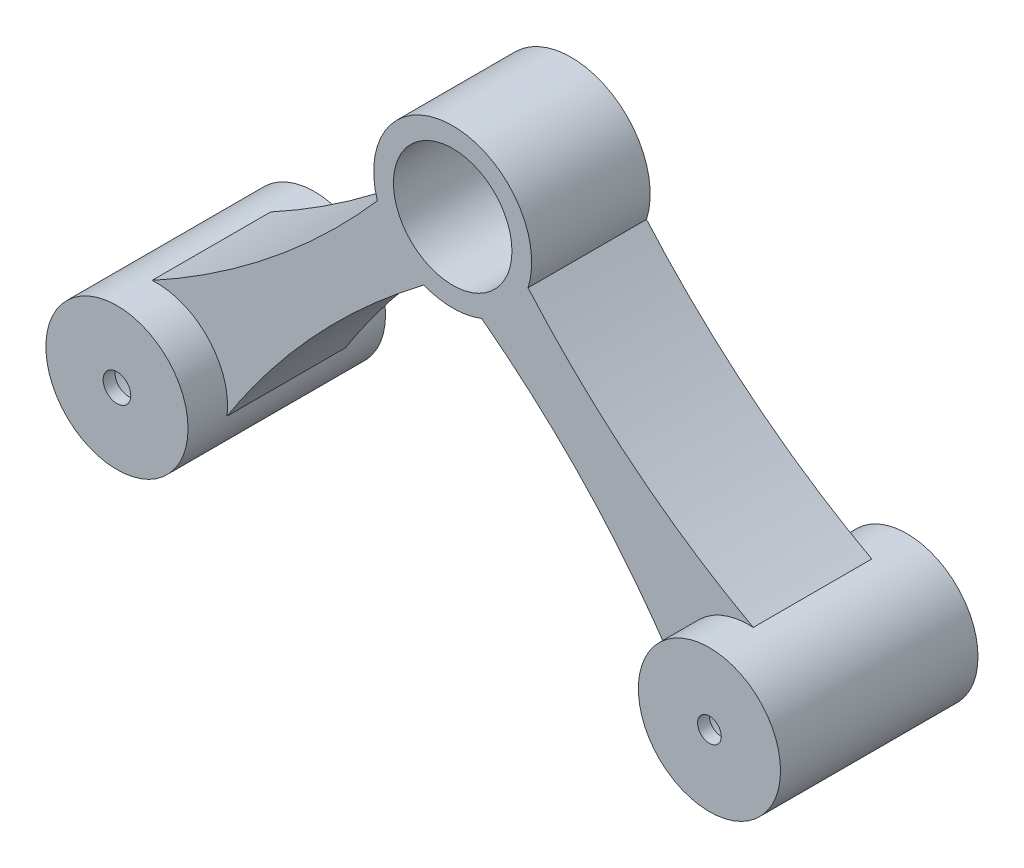
ISO-10303-21;
HEADER;
FILE_DESCRIPTION(('STEP AP214'),'2;1');
FILE_NAME('part.step','',(''),(''),'','','');
FILE_SCHEMA(('AUTOMOTIVE_DESIGN { 1 0 10303 214 1 1 1 1 }'));
ENDSEC;
DATA;
#1=APPLICATION_CONTEXT('core data for automotive mechanical design processes');
#2=APPLICATION_PROTOCOL_DEFINITION('international standard','automotive_design',2000,#1);
#3=PRODUCT_CONTEXT('',#1,'mechanical');
#4=PRODUCT('Part','Part','',(#3));
#5=PRODUCT_RELATED_PRODUCT_CATEGORY('part','',(#4));
#6=PRODUCT_DEFINITION_FORMATION('','',#4);
#7=PRODUCT_DEFINITION_CONTEXT('part definition',#1,'design');
#8=PRODUCT_DEFINITION('design','',#6,#7);
#9=PRODUCT_DEFINITION_SHAPE('','',#8);
#10=(LENGTH_UNIT() NAMED_UNIT(*) SI_UNIT(.MILLI.,.METRE.));
#11=(NAMED_UNIT(*) PLANE_ANGLE_UNIT() SI_UNIT($,.RADIAN.));
#12=(NAMED_UNIT(*) SI_UNIT($,.STERADIAN.) SOLID_ANGLE_UNIT());
#13=UNCERTAINTY_MEASURE_WITH_UNIT(LENGTH_MEASURE(1.E-05),#10,'distance_accuracy_value','');
#14=(GEOMETRIC_REPRESENTATION_CONTEXT(3) GLOBAL_UNCERTAINTY_ASSIGNED_CONTEXT((#13)) GLOBAL_UNIT_ASSIGNED_CONTEXT((#10,
#11,#12)) REPRESENTATION_CONTEXT('',''));
#15=CARTESIAN_POINT('',(0.,0.,0.));
#16=DIRECTION('',(0.,0.,1.));
#17=DIRECTION('',(1.,0.,0.));
#18=AXIS2_PLACEMENT_3D('',#15,#16,#17);
#19=CARTESIAN_POINT('',(150.,0.,-50.));
#20=DIRECTION('',(0.,0.,1.));
#21=DIRECTION('',(1.,0.,0.));
#22=AXIS2_PLACEMENT_3D('',#19,#20,#21);
#23=CYLINDRICAL_SURFACE('',#22,13.);
#24=CARTESIAN_POINT('',(150.,0.,-50.));
#25=DIRECTION('',(0.,0.,1.));
#26=DIRECTION('',(1.,0.,0.));
#27=AXIS2_PLACEMENT_3D('',#24,#25,#26);
#28=CIRCLE('',#27,13.);
#29=CARTESIAN_POINT('',(163.,0.,-50.));
#30=VERTEX_POINT('',#29);
#31=EDGE_CURVE('E65',#30,#30,#28,.T.);
#32=ORIENTED_EDGE('',*,*,#31,.F.);
#33=EDGE_LOOP('',(#32));
#34=FACE_BOUND('',#33,.T.);
#35=CARTESIAN_POINT('',(150.,0.,-3.));
#36=DIRECTION('',(0.,0.,1.));
#37=DIRECTION('',(1.,0.,0.));
#38=AXIS2_PLACEMENT_3D('',#35,#36,#37);
#39=CIRCLE('',#38,13.);
#40=CARTESIAN_POINT('',(163.,0.,-3.));
#41=VERTEX_POINT('',#40);
#42=EDGE_CURVE('E11',#41,#41,#39,.F.);
#43=ORIENTED_EDGE('',*,*,#42,.F.);
#44=EDGE_LOOP('',(#43));
#45=FACE_BOUND('',#44,.T.);
#46=ADVANCED_FACE('F49',(#34,#45),#23,.F.);
#47=CARTESIAN_POINT('',(150.,0.,-50.));
#48=DIRECTION('',(0.,0.,1.));
#49=DIRECTION('',(1.,0.,0.));
#50=AXIS2_PLACEMENT_3D('',#47,#48,#49);
#51=CYLINDRICAL_SURFACE('',#50,18.);
#52=CARTESIAN_POINT('',(150.,0.,-50.));
#53=DIRECTION('',(0.,0.,1.));
#54=DIRECTION('',(1.,0.,0.));
#55=AXIS2_PLACEMENT_3D('',#52,#53,#54);
#56=CIRCLE('',#55,18.);
#57=CARTESIAN_POINT('',(168.,0.,-50.));
#58=VERTEX_POINT('',#57);
#59=EDGE_CURVE('E56',#58,#58,#56,.T.);
#60=ORIENTED_EDGE('',*,*,#59,.T.);
#61=EDGE_LOOP('',(#60));
#62=FACE_BOUND('',#61,.T.);
#63=CARTESIAN_POINT('',(150.,0.,0.));
#64=DIRECTION('',(0.,0.,1.));
#65=DIRECTION('',(1.,0.,0.));
#66=AXIS2_PLACEMENT_3D('',#63,#64,#65);
#67=CIRCLE('',#66,18.);
#68=CARTESIAN_POINT('',(168.,0.,0.));
#69=VERTEX_POINT('',#68);
#70=EDGE_CURVE('E60',#69,#69,#67,.T.);
#71=ORIENTED_EDGE('',*,*,#70,.F.);
#72=EDGE_LOOP('',(#71));
#73=FACE_BOUND('',#72,.T.);
#74=ADVANCED_FACE('F51',(#62,#73),#51,.T.);
#75=CARTESIAN_POINT('',(150.,0.,-50.));
#76=DIRECTION('',(0.,0.,1.));
#77=DIRECTION('',(1.,0.,0.));
#78=AXIS2_PLACEMENT_3D('',#75,#76,#77);
#79=PLANE('',#78);
#80=ORIENTED_EDGE('',*,*,#31,.T.);
#81=EDGE_LOOP('',(#80));
#82=FACE_BOUND('',#81,.T.);
#83=ORIENTED_EDGE('',*,*,#59,.F.);
#84=EDGE_LOOP('',(#83));
#85=FACE_BOUND('',#84,.T.);
#86=ADVANCED_FACE('F86',(#82,#85),#79,.F.);
#87=CARTESIAN_POINT('',(150.,0.,0.));
#88=DIRECTION('',(0.,0.,1.));
#89=DIRECTION('',(1.,0.,0.));
#90=AXIS2_PLACEMENT_3D('',#87,#88,#89);
#91=PLANE('',#90);
#92=ORIENTED_EDGE('',*,*,#70,.T.);
#93=EDGE_LOOP('',(#92));
#94=FACE_BOUND('',#93,.T.);
#95=CARTESIAN_POINT('',(150.,0.,0.));
#96=DIRECTION('',(0.,0.,1.));
#97=DIRECTION('',(1.,0.,0.));
#98=AXIS2_PLACEMENT_3D('',#95,#96,#97);
#99=CIRCLE('',#98,2.99999999999999);
#100=CARTESIAN_POINT('',(153.,0.,0.));
#101=VERTEX_POINT('',#100);
#102=EDGE_CURVE('E70',#101,#101,#99,.T.);
#103=ORIENTED_EDGE('',*,*,#102,.F.);
#104=EDGE_LOOP('',(#103));
#105=FACE_BOUND('',#104,.T.);
#106=ADVANCED_FACE('F84',(#94,#105),#91,.T.);
#107=CARTESIAN_POINT('',(150.,0.,-3.));
#108=DIRECTION('',(0.,0.,1.));
#109=DIRECTION('',(1.,0.,0.));
#110=AXIS2_PLACEMENT_3D('',#107,#108,#109);
#111=PLANE('',#110);
#112=CARTESIAN_POINT('',(150.,0.,-3.));
#113=DIRECTION('',(0.,0.,1.));
#114=DIRECTION('',(1.,0.,0.));
#115=AXIS2_PLACEMENT_3D('',#112,#113,#114);
#116=CIRCLE('',#115,2.99999999999999);
#117=CARTESIAN_POINT('',(153.,0.,-3.));
#118=VERTEX_POINT('',#117);
#119=EDGE_CURVE('E69',#118,#118,#116,.T.);
#120=ORIENTED_EDGE('',*,*,#119,.T.);
#121=EDGE_LOOP('',(#120));
#122=FACE_BOUND('',#121,.T.);
#123=ORIENTED_EDGE('',*,*,#42,.T.);
#124=EDGE_LOOP('',(#123));
#125=FACE_BOUND('',#124,.T.);
#126=ADVANCED_FACE('F76',(#122,#125),#111,.F.);
#127=CARTESIAN_POINT('',(150.,0.,-3.));
#128=DIRECTION('',(0.,0.,1.));
#129=DIRECTION('',(1.,0.,0.));
#130=AXIS2_PLACEMENT_3D('',#127,#128,#129);
#131=CYLINDRICAL_SURFACE('',#130,2.99999999999999);
#132=ORIENTED_EDGE('',*,*,#119,.F.);
#133=EDGE_LOOP('',(#132));
#134=FACE_BOUND('',#133,.T.);
#135=ORIENTED_EDGE('',*,*,#102,.T.);
#136=EDGE_LOOP('',(#135));
#137=FACE_BOUND('',#136,.T.);
#138=ADVANCED_FACE('F78',(#134,#137),#131,.F.);
#139=CLOSED_SHELL('',(#46,#74,#86,#106,#126,#138));
#140=MANIFOLD_SOLID_BREP('B2',#139);
#141=CARTESIAN_POINT('',(85.5595001161423,52.9534332778714,-20.));
#142=CARTESIAN_POINT('',(112.117826532757,31.6252964037565,-20.));
#143=CARTESIAN_POINT('',(132.751116671535,5.14548578085576,-20.));
#144=B_SPLINE_CURVE_WITH_KNOTS('',2,(#141,#142,#143),.UNSPECIFIED.,.F.,.F.,(3,3),(0.,
0.925026666486485),.UNSPECIFIED.);
#145=DIRECTION('',(0.,0.,-1.));
#146=VECTOR('',#145,1.);
#147=SURFACE_OF_LINEAR_EXTRUSION('',#144,#146);
#148=CARTESIAN_POINT('',(85.5595001161423,52.9534332778714,-40.));
#149=CARTESIAN_POINT('',(112.117826532757,31.6252964037565,-40.));
#150=CARTESIAN_POINT('',(132.751116671535,5.14548578085576,-40.));
#151=B_SPLINE_CURVE_WITH_KNOTS('',2,(#148,#149,#150),.UNSPECIFIED.,.F.,.F.,(3,3),(0.,
0.925026666486485),.UNSPECIFIED.);
#152=CARTESIAN_POINT('',(122.957915374539,17.0403960061639,-40.));
#153=VERTEX_POINT('',#152);
#154=CARTESIAN_POINT('',(132.751116671535,5.14548578085576,-40.));
#155=VERTEX_POINT('',#154);
#156=EDGE_CURVE('E344',#153,#155,#151,.T.);
#157=ORIENTED_EDGE('',*,*,#156,.F.);
#158=DIRECTION('',(0.,0.,-1.));
#159=VECTOR('',#158,1.);
#160=CARTESIAN_POINT('',(122.957915374554,17.0403960061769,-35.));
#161=LINE('',#160,#159);
#162=CARTESIAN_POINT('',(122.957915374554,17.0403960061769,-35.));
#163=VERTEX_POINT('',#162);
#164=EDGE_CURVE('E161',#163,#153,#161,.T.);
#165=ORIENTED_EDGE('',*,*,#164,.F.);
#166=CARTESIAN_POINT('',(-770214.954696789,-638067.56018092,-35.));
#167=CARTESIAN_POINT('',(754762.011550407,656157.192138622,-35.));
#168=CARTESIAN_POINT('',(-738817.236742502,-674178.662512326,-35.));
#169=B_SPLINE_CURVE_WITH_KNOTS('',2,(#166,#167,#168),.UNSPECIFIED.,.F.,.F.,(3,3),(0.,1.),.UNSPECIFIED.);
#170=CARTESIAN_POINT('',(98.6874308703959,41.7696027411596,-35.));
#171=VERTEX_POINT('',#170);
#172=EDGE_CURVE('E311',#171,#163,#169,.T.);
#173=ORIENTED_EDGE('',*,*,#172,.F.);
#174=DIRECTION('',(0.,0.,-1.));
#175=VECTOR('',#174,1.);
#176=CARTESIAN_POINT('',(98.6874308703959,41.7696027411596,-35.));
#177=LINE('',#176,#175);
#178=CARTESIAN_POINT('',(98.6874308703959,41.7696027411596,-40.));
#179=VERTEX_POINT('',#178);
#180=EDGE_CURVE('E318',#171,#179,#177,.T.);
#181=ORIENTED_EDGE('',*,*,#180,.T.);
#182=CARTESIAN_POINT('',(85.5595001161423,52.9534332778714,-40.));
#183=VERTEX_POINT('',#182);
#184=EDGE_CURVE('E712',#183,#179,#151,.T.);
#185=ORIENTED_EDGE('',*,*,#184,.F.);
#186=DIRECTION('',(0.,0.,-1.));
#187=VECTOR('',#186,1.);
#188=CARTESIAN_POINT('',(85.5595001161423,52.9534332778714,-20.));
#189=LINE('',#188,#187);
#190=CARTESIAN_POINT('',(85.5595001161423,52.9534332778714,-20.));
#191=VERTEX_POINT('',#190);
#192=EDGE_CURVE('E700',#191,#183,#189,.T.);
#193=ORIENTED_EDGE('',*,*,#192,.F.);
#194=CARTESIAN_POINT('',(132.751116671535,5.14548578085576,-20.));
#195=VERTEX_POINT('',#194);
#196=EDGE_CURVE('E349',#191,#195,#144,.T.);
#197=ORIENTED_EDGE('',*,*,#196,.T.);
#198=DIRECTION('',(0.,0.,-1.));
#199=VECTOR('',#198,1.);
#200=CARTESIAN_POINT('',(132.751116671535,5.14548578085576,-20.));
#201=LINE('',#200,#199);
#202=EDGE_CURVE('E405',#195,#155,#201,.T.);
#203=ORIENTED_EDGE('',*,*,#202,.T.);
#204=EDGE_LOOP('',(#157,#165,#173,#181,#185,#193,#197,#203));
#205=FACE_BOUND('',#204,.T.);
#206=ADVANCED_FACE('F146',(#205),#147,.T.);
#207=CARTESIAN_POINT('',(143.663827086878,16.8479349718301,-20.));
#208=CARTESIAN_POINT('',(115.809214389963,35.5838252383898,-20.));
#209=CARTESIAN_POINT('',(92.6804165859568,60.5896812867999,-20.));
#210=B_SPLINE_CURVE_WITH_KNOTS('',2,(#207,#208,#209),.UNSPECIFIED.,.F.,.F.,(3,3),(0.,
0.925026666486485),.UNSPECIFIED.);
#211=DIRECTION('',(0.,0.,-1.));
#212=VECTOR('',#211,1.);
#213=SURFACE_OF_LINEAR_EXTRUSION('',#210,#212);
#214=CARTESIAN_POINT('',(621138.64852694,784195.475864561,-35.));
#215=CARTESIAN_POINT('',(-601769.753226188,-798545.026562383,-35.));
#216=CARTESIAN_POINT('',(582925.31693777,812997.727394302,-35.));
#217=B_SPLINE_CURVE_WITH_KNOTS('',2,(#214,#215,#216),.UNSPECIFIED.,.F.,.F.,(3,3),(0.,1.),.UNSPECIFIED.);
#218=CARTESIAN_POINT('',(131.114753098131,25.7875335130646,-35.));
#219=VERTEX_POINT('',#218);
#220=CARTESIAN_POINT('',(104.850052290701,48.1803055667996,-35.));
#221=VERTEX_POINT('',#220);
#222=EDGE_CURVE('E313',#219,#221,#217,.T.);
#223=ORIENTED_EDGE('',*,*,#222,.F.);
#224=DIRECTION('',(0.,0.,-1.));
#225=VECTOR('',#224,1.);
#226=CARTESIAN_POINT('',(131.114753098131,25.7875335130646,-35.));
#227=LINE('',#226,#225);
#228=CARTESIAN_POINT('',(131.114753098131,25.7875335130646,-40.));
#229=VERTEX_POINT('',#228);
#230=EDGE_CURVE('E345',#219,#229,#227,.T.);
#231=ORIENTED_EDGE('',*,*,#230,.T.);
#232=CARTESIAN_POINT('',(143.663827086878,16.8479349718301,-40.));
#233=CARTESIAN_POINT('',(115.809214389963,35.5838252383898,-40.));
#234=CARTESIAN_POINT('',(92.6804165859568,60.5896812867999,-40.));
#235=B_SPLINE_CURVE_WITH_KNOTS('',2,(#232,#233,#234),.UNSPECIFIED.,.F.,.F.,(3,3),(0.,
0.925026666486485),.UNSPECIFIED.);
#236=CARTESIAN_POINT('',(143.663827086878,16.8479349718301,-40.));
#237=VERTEX_POINT('',#236);
#238=EDGE_CURVE('E356',#237,#229,#235,.T.);
#239=ORIENTED_EDGE('',*,*,#238,.F.);
#240=DIRECTION('',(0.,0.,-1.));
#241=VECTOR('',#240,1.);
#242=CARTESIAN_POINT('',(143.663827086878,16.8479349718301,-20.));
#243=LINE('',#242,#241);
#244=CARTESIAN_POINT('',(143.663827086878,16.8479349718301,-20.));
#245=VERTEX_POINT('',#244);
#246=EDGE_CURVE('E692',#245,#237,#243,.T.);
#247=ORIENTED_EDGE('',*,*,#246,.F.);
#248=CARTESIAN_POINT('',(92.6804165859568,60.5896812867999,-20.));
#249=VERTEX_POINT('',#248);
#250=EDGE_CURVE('E706',#245,#249,#210,.T.);
#251=ORIENTED_EDGE('',*,*,#250,.T.);
#252=DIRECTION('',(0.,0.,-1.));
#253=VECTOR('',#252,1.);
#254=CARTESIAN_POINT('',(92.6804165859568,60.5896812867999,-20.));
#255=LINE('',#254,#253);
#256=CARTESIAN_POINT('',(92.6804165859568,60.5896812867999,-40.));
#257=VERTEX_POINT('',#256);
#258=EDGE_CURVE('E695',#249,#257,#255,.T.);
#259=ORIENTED_EDGE('',*,*,#258,.T.);
#260=CARTESIAN_POINT('',(104.850052290713,48.1803055668121,-40.));
#261=VERTEX_POINT('',#260);
#262=EDGE_CURVE('E721',#261,#257,#235,.T.);
#263=ORIENTED_EDGE('',*,*,#262,.F.);
#264=DIRECTION('',(0.,0.,-1.));
#265=VECTOR('',#264,1.);
#266=CARTESIAN_POINT('',(104.850052290701,48.1803055667996,-35.));
#267=LINE('',#266,#265);
#268=EDGE_CURVE('E322',#221,#261,#267,.T.);
#269=ORIENTED_EDGE('',*,*,#268,.F.);
#270=EDGE_LOOP('',(#223,#231,#239,#247,#251,#259,#263,#269));
#271=FACE_BOUND('',#270,.T.);
#272=ADVANCED_FACE('F365',(#271),#213,.T.);
#273=CARTESIAN_POINT('',(40.1269744074555,26.4743459118084,-40.));
#274=DIRECTION('',(0.,0.,-1.));
#275=DIRECTION('',(-1.,0.,0.));
#276=AXIS2_PLACEMENT_3D('',#273,#274,#275);
#277=PLANE('',#276);
#278=DIRECTION('',(0.681998361191194,0.731353700566645,0.));
#279=VECTOR('',#278,1.);
#280=CARTESIAN_POINT('',(122.957915374554,17.0403960061769,-40.));
#281=LINE('',#280,#279);
#282=EDGE_CURVE('E326',#153,#229,#281,.T.);
#283=ORIENTED_EDGE('',*,*,#282,.F.);
#284=ORIENTED_EDGE('',*,*,#156,.T.);
#285=CARTESIAN_POINT('',(150.,0.,-40.));
#286=DIRECTION('',(0.,0.,-1.));
#287=DIRECTION('',(1.,0.,0.));
#288=AXIS2_PLACEMENT_3D('',#285,#286,#287);
#289=CIRCLE('',#288,18.);
#290=CARTESIAN_POINT('',(132.153464612983,-2.34545830914898,-40.));
#291=VERTEX_POINT('',#290);
#292=EDGE_CURVE('E414',#291,#155,#289,.T.);
#293=ORIENTED_EDGE('',*,*,#292,.F.);
#294=CARTESIAN_POINT('',(82.3388866100753,51.3337734032344,-40.));
#295=CARTESIAN_POINT('',(112.49987557356,28.4545342765741,-40.));
#296=CARTESIAN_POINT('',(132.153464612983,-2.34545830914898,-40.));
#297=B_SPLINE_CURVE_WITH_KNOTS('',2,(#294,#295,#296),.UNSPECIFIED.,.F.,.F.,(3,3),(0.,
0.881213021259368),.UNSPECIFIED.);
#298=CARTESIAN_POINT('',(82.3388866100751,51.3337734032348,-40.));
#299=VERTEX_POINT('',#298);
#300=EDGE_CURVE('E399',#299,#291,#297,.T.);
#301=ORIENTED_EDGE('',*,*,#300,.F.);
#302=CARTESIAN_POINT('',(74.9999999999995,69.9386314603244,-40.));
#303=DIRECTION('',(0.,0.,1.));
#304=DIRECTION('',(1.,0.,0.));
#305=AXIS2_PLACEMENT_3D('',#302,#303,#304);
#306=CIRCLE('',#305,20.);
#307=CARTESIAN_POINT('',(67.6611133899247,51.3337734032344,-40.));
#308=VERTEX_POINT('',#307);
#309=EDGE_CURVE('E532',#308,#299,#306,.T.);
#310=ORIENTED_EDGE('',*,*,#309,.F.);
#311=CARTESIAN_POINT('',(67.6611133899247,51.3337734032344,-40.));
#312=CARTESIAN_POINT('',(37.5001244264403,28.4545342765741,-40.));
#313=CARTESIAN_POINT('',(17.8465353870168,-2.34545830914898,-40.));
#314=B_SPLINE_CURVE_WITH_KNOTS('',2,(#311,#312,#313),.UNSPECIFIED.,.F.,.F.,(3,3),(0.,
0.881213021259368),.UNSPECIFIED.);
#315=CARTESIAN_POINT('',(17.8465353870168,-2.34545830914898,-40.));
#316=VERTEX_POINT('',#315);
#317=EDGE_CURVE('E523',#308,#316,#314,.T.);
#318=ORIENTED_EDGE('',*,*,#317,.T.);
#319=CARTESIAN_POINT('',(0.,0.,-40.));
#320=DIRECTION('',(0.,0.,1.));
#321=DIRECTION('',(-1.,0.,0.));
#322=AXIS2_PLACEMENT_3D('',#319,#320,#321);
#323=CIRCLE('',#322,18.);
#324=CARTESIAN_POINT('',(17.2488833284654,5.14548578085576,-40.));
#325=VERTEX_POINT('',#324);
#326=EDGE_CURVE('E533',#316,#325,#323,.T.);
#327=ORIENTED_EDGE('',*,*,#326,.T.);
#328=CARTESIAN_POINT('',(64.4404998838577,52.9534332778714,-40.));
#329=CARTESIAN_POINT('',(37.8821734672433,31.6252964037565,-40.));
#330=CARTESIAN_POINT('',(17.2488833284654,5.14548578085576,-40.));
#331=B_SPLINE_CURVE_WITH_KNOTS('',2,(#328,#329,#330),.UNSPECIFIED.,.F.,.F.,(3,3),(0.,
0.925026666486485),.UNSPECIFIED.);
#332=CARTESIAN_POINT('',(27.0420846254464,17.0403960061769,-40.));
#333=VERTEX_POINT('',#332);
#334=EDGE_CURVE('E461',#333,#325,#331,.T.);
#335=ORIENTED_EDGE('',*,*,#334,.F.);
#336=DIRECTION('',(-0.681998361191194,0.731353700566645,0.));
#337=VECTOR('',#336,1.);
#338=CARTESIAN_POINT('',(27.0420846254464,17.0403960061769,-40.));
#339=LINE('',#338,#337);
#340=CARTESIAN_POINT('',(18.8852469092796,25.7875335186786,-40.));
#341=VERTEX_POINT('',#340);
#342=EDGE_CURVE('E423',#333,#341,#339,.T.);
#343=ORIENTED_EDGE('',*,*,#342,.T.);
#344=CARTESIAN_POINT('',(6.33617291312231,16.8479349718301,-40.));
#345=CARTESIAN_POINT('',(34.1907856100367,35.5838252383898,-40.));
#346=CARTESIAN_POINT('',(57.3195834140432,60.5896812867999,-40.));
#347=B_SPLINE_CURVE_WITH_KNOTS('',2,(#344,#345,#346),.UNSPECIFIED.,.F.,.F.,(3,3),(0.,
0.925026666486485),.UNSPECIFIED.);
#348=CARTESIAN_POINT('',(6.33617291312231,16.8479349718301,-40.));
#349=VERTEX_POINT('',#348);
#350=EDGE_CURVE('E621',#349,#341,#347,.T.);
#351=ORIENTED_EDGE('',*,*,#350,.F.);
#352=CARTESIAN_POINT('',(-1.09483351344223,17.9666730247379,-40.));
#353=VERTEX_POINT('',#352);
#354=EDGE_CURVE('E531',#349,#353,#323,.T.);
#355=ORIENTED_EDGE('',*,*,#354,.T.);
#356=CARTESIAN_POINT('',(-1.09483351344223,17.9666730247379,-40.));
#357=CARTESIAN_POINT('',(31.0010969061505,35.4238880349221,-40.));
#358=CARTESIAN_POINT('',(55.928527590933,63.9154313017531,-40.));
#359=B_SPLINE_CURVE_WITH_KNOTS('',2,(#356,#357,#358),.UNSPECIFIED.,.F.,.F.,(3,3),(0.,
0.881213021259368),.UNSPECIFIED.);
#360=CARTESIAN_POINT('',(55.9285275909329,63.9154313017531,-40.));
#361=VERTEX_POINT('',#360);
#362=EDGE_CURVE('E539',#353,#361,#359,.T.);
#363=ORIENTED_EDGE('',*,*,#362,.T.);
#364=CARTESIAN_POINT('',(94.0714724090671,63.9154313017531,-40.));
#365=VERTEX_POINT('',#364);
#366=EDGE_CURVE('E600',#365,#361,#306,.T.);
#367=ORIENTED_EDGE('',*,*,#366,.F.);
#368=CARTESIAN_POINT('',(151.094833513442,17.9666730247379,-40.));
#369=CARTESIAN_POINT('',(118.998903093849,35.4238880349221,-40.));
#370=CARTESIAN_POINT('',(94.071472409067,63.9154313017531,-40.));
#371=B_SPLINE_CURVE_WITH_KNOTS('',2,(#368,#369,#370),.UNSPECIFIED.,.F.,.F.,(3,3),(0.,
0.881213021259368),.UNSPECIFIED.);
#372=CARTESIAN_POINT('',(151.094833513442,17.9666730247379,-40.));
#373=VERTEX_POINT('',#372);
#374=EDGE_CURVE('E404',#373,#365,#371,.T.);
#375=ORIENTED_EDGE('',*,*,#374,.F.);
#376=EDGE_CURVE('E413',#237,#373,#289,.T.);
#377=ORIENTED_EDGE('',*,*,#376,.F.);
#378=ORIENTED_EDGE('',*,*,#238,.T.);
#379=EDGE_LOOP('',(#283,#284,#293,#301,#310,#318,#327,#335,#343,#351,#355,#363,#367,#375,#377,#378));
#380=FACE_BOUND('',#379,.T.);
#381=CARTESIAN_POINT('',(64.4404998838577,52.9534332778714,-40.));
#382=VERTEX_POINT('',#381);
#383=CARTESIAN_POINT('',(51.3125691295989,41.7696027411651,-40.));
#384=VERTEX_POINT('',#383);
#385=EDGE_CURVE('E626',#382,#384,#331,.T.);
#386=ORIENTED_EDGE('',*,*,#385,.F.);
#387=CARTESIAN_POINT('',(74.9999999999995,69.9386314603244,-40.));
#388=DIRECTION('',(0.,0.,1.));
#389=DIRECTION('',(-1.,0.,0.));
#390=AXIS2_PLACEMENT_3D('',#387,#388,#389);
#391=CIRCLE('',#390,20.);
#392=CARTESIAN_POINT('',(57.3195834140432,60.5896812867999,-40.));
#393=VERTEX_POINT('',#392);
#394=EDGE_CURVE('E477',#393,#382,#391,.T.);
#395=ORIENTED_EDGE('',*,*,#394,.F.);
#396=CARTESIAN_POINT('',(45.1499477092993,48.1803055667996,-40.));
#397=VERTEX_POINT('',#396);
#398=EDGE_CURVE('E625',#397,#393,#347,.T.);
#399=ORIENTED_EDGE('',*,*,#398,.F.);
#400=DIRECTION('',(0.69302013344821,-0.720918230200503,0.));
#401=VECTOR('',#400,1.);
#402=CARTESIAN_POINT('',(51.3125691296041,41.7696027411596,-40.));
#403=LINE('',#402,#401);
#404=EDGE_CURVE('E437',#397,#384,#403,.T.);
#405=ORIENTED_EDGE('',*,*,#404,.T.);
#406=EDGE_LOOP('',(#386,#395,#399,#405));
#407=FACE_BOUND('',#406,.T.);
#408=CARTESIAN_POINT('',(74.9999999999995,69.9386314603244,-40.));
#409=DIRECTION('',(0.,0.,1.));
#410=DIRECTION('',(1.,0.,0.));
#411=AXIS2_PLACEMENT_3D('',#408,#409,#410);
#412=CIRCLE('',#411,15.);
#413=CARTESIAN_POINT('',(89.9999999999995,69.9386314603244,-40.));
#414=VERTEX_POINT('',#413);
#415=EDGE_CURVE('E606',#414,#414,#412,.T.);
#416=ORIENTED_EDGE('',*,*,#415,.T.);
#417=EDGE_LOOP('',(#416));
#418=FACE_BOUND('',#417,.T.);
#419=CARTESIAN_POINT('',(75.0000000000005,69.9386314603244,-40.));
#420=DIRECTION('',(0.,0.,-1.));
#421=DIRECTION('',(1.,0.,0.));
#422=AXIS2_PLACEMENT_3D('',#419,#420,#421);
#423=CIRCLE('',#422,20.);
#424=EDGE_CURVE('E716',#257,#183,#423,.T.);
#425=ORIENTED_EDGE('',*,*,#424,.T.);
#426=ORIENTED_EDGE('',*,*,#184,.T.);
#427=DIRECTION('',(-0.69302013344821,-0.720918230200503,0.));
#428=VECTOR('',#427,1.);
#429=CARTESIAN_POINT('',(98.6874308703959,41.7696027411596,-40.));
#430=LINE('',#429,#428);
#431=EDGE_CURVE('E169',#261,#179,#430,.T.);
#432=ORIENTED_EDGE('',*,*,#431,.F.);
#433=ORIENTED_EDGE('',*,*,#262,.T.);
#434=EDGE_LOOP('',(#425,#426,#432,#433));
#435=FACE_BOUND('',#434,.T.);
#436=ADVANCED_FACE('F372',(#380,#407,#418,#435),#277,.T.);
#437=CARTESIAN_POINT('',(150.,0.,-10.));
#438=DIRECTION('',(0.,0.,-1.));
#439=DIRECTION('',(-1.,0.,0.));
#440=AXIS2_PLACEMENT_3D('',#437,#438,#439);
#441=CYLINDRICAL_SURFACE('',#440,18.);
#442=ORIENTED_EDGE('',*,*,#202,.F.);
#443=CARTESIAN_POINT('',(150.,0.,-20.));
#444=DIRECTION('',(0.,0.,-1.));
#445=DIRECTION('',(1.,0.,0.));
#446=AXIS2_PLACEMENT_3D('',#443,#444,#445);
#447=CIRCLE('',#446,18.);
#448=EDGE_CURVE('E693',#195,#245,#447,.T.);
#449=ORIENTED_EDGE('',*,*,#448,.T.);
#450=ORIENTED_EDGE('',*,*,#246,.T.);
#451=ORIENTED_EDGE('',*,*,#376,.T.);
#452=DIRECTION('',(0.,0.,-1.));
#453=VECTOR('',#452,1.);
#454=CARTESIAN_POINT('',(151.094833513442,17.9666730247379,-10.));
#455=LINE('',#454,#453);
#456=CARTESIAN_POINT('',(151.094833513442,17.9666730247379,-10.));
#457=VERTEX_POINT('',#456);
#458=EDGE_CURVE('E424',#457,#373,#455,.T.);
#459=ORIENTED_EDGE('',*,*,#458,.F.);
#460=CARTESIAN_POINT('',(150.,0.,-10.));
#461=DIRECTION('',(0.,0.,-1.));
#462=DIRECTION('',(1.,0.,0.));
#463=AXIS2_PLACEMENT_3D('',#460,#461,#462);
#464=CIRCLE('',#463,18.);
#465=CARTESIAN_POINT('',(132.153464612983,-2.34545830914898,-10.));
#466=VERTEX_POINT('',#465);
#467=EDGE_CURVE('E388',#466,#457,#464,.T.);
#468=ORIENTED_EDGE('',*,*,#467,.F.);
#469=DIRECTION('',(0.,0.,-1.));
#470=VECTOR('',#469,1.);
#471=CARTESIAN_POINT('',(132.153464612983,-2.34545830914898,-10.));
#472=LINE('',#471,#470);
#473=EDGE_CURVE('E420',#466,#291,#472,.T.);
#474=ORIENTED_EDGE('',*,*,#473,.T.);
#475=ORIENTED_EDGE('',*,*,#292,.T.);
#476=EDGE_LOOP('',(#442,#449,#450,#451,#459,#468,#474,#475));
#477=FACE_BOUND('',#476,.T.);
#478=ADVANCED_FACE('F368',(#477),#441,.F.);
#479=CARTESIAN_POINT('',(74.9999999999995,69.9386314603244,-40.));
#480=DIRECTION('',(0.,0.,1.));
#481=DIRECTION('',(1.,0.,0.));
#482=AXIS2_PLACEMENT_3D('',#479,#480,#481);
#483=CYLINDRICAL_SURFACE('',#482,20.);
#484=ORIENTED_EDGE('',*,*,#309,.T.);
#485=DIRECTION('',(0.,0.,-1.));
#486=VECTOR('',#485,1.);
#487=CARTESIAN_POINT('',(82.3388866100753,51.3337734032344,-10.));
#488=LINE('',#487,#486);
#489=CARTESIAN_POINT('',(82.3388866100751,51.3337734032348,-10.));
#490=VERTEX_POINT('',#489);
#491=EDGE_CURVE('E398',#490,#299,#488,.T.);
#492=ORIENTED_EDGE('',*,*,#491,.F.);
#493=CARTESIAN_POINT('',(74.9999999999995,69.9386314603244,-10.));
#494=DIRECTION('',(0.,0.,1.));
#495=DIRECTION('',(1.,0.,0.));
#496=AXIS2_PLACEMENT_3D('',#493,#494,#495);
#497=CIRCLE('',#496,20.);
#498=CARTESIAN_POINT('',(67.6611133899247,51.3337734032344,-10.));
#499=VERTEX_POINT('',#498);
#500=EDGE_CURVE('E595',#499,#490,#497,.T.);
#501=ORIENTED_EDGE('',*,*,#500,.F.);
#502=DIRECTION('',(0.,0.,-1.));
#503=VECTOR('',#502,1.);
#504=CARTESIAN_POINT('',(67.6611133899247,51.3337734032344,-10.));
#505=LINE('',#504,#503);
#506=EDGE_CURVE('E545',#499,#308,#505,.T.);
#507=ORIENTED_EDGE('',*,*,#506,.T.);
#508=EDGE_LOOP('',(#484,#492,#501,#507));
#509=FACE_BOUND('',#508,.T.);
#510=ADVANCED_FACE('F371',(#509),#483,.T.);
#511=CARTESIAN_POINT('',(94.0714724090661,63.9154313017534,-10.));
#512=VERTEX_POINT('',#511);
#513=CARTESIAN_POINT('',(55.9285275909329,63.9154313017531,-10.));
#514=VERTEX_POINT('',#513);
#515=EDGE_CURVE('E601',#512,#514,#497,.T.);
#516=ORIENTED_EDGE('',*,*,#515,.F.);
#517=DIRECTION('',(0.,0.,-1.));
#518=VECTOR('',#517,1.);
#519=CARTESIAN_POINT('',(94.0714724090671,63.9154313017531,-10.));
#520=LINE('',#519,#518);
#521=EDGE_CURVE('E427',#512,#365,#520,.T.);
#522=ORIENTED_EDGE('',*,*,#521,.T.);
#523=ORIENTED_EDGE('',*,*,#366,.T.);
#524=DIRECTION('',(0.,0.,-1.));
#525=VECTOR('',#524,1.);
#526=CARTESIAN_POINT('',(55.9285275909329,63.9154313017531,-10.));
#527=LINE('',#526,#525);
#528=EDGE_CURVE('E552',#514,#361,#527,.T.);
#529=ORIENTED_EDGE('',*,*,#528,.F.);
#530=EDGE_LOOP('',(#516,#522,#523,#529));
#531=FACE_BOUND('',#530,.T.);
#532=ADVANCED_FACE('F498',(#531),#483,.T.);
#533=CARTESIAN_POINT('',(0.,0.,-50.));
#534=DIRECTION('',(0.,0.,1.));
#535=DIRECTION('',(1.,0.,0.));
#536=AXIS2_PLACEMENT_3D('',#533,#534,#535);
#537=CYLINDRICAL_SURFACE('',#536,18.);
#538=CARTESIAN_POINT('',(0.,0.,-50.));
#539=DIRECTION('',(0.,0.,1.));
#540=DIRECTION('',(1.,0.,0.));
#541=AXIS2_PLACEMENT_3D('',#538,#539,#540);
#542=CIRCLE('',#541,18.);
#543=CARTESIAN_POINT('',(18.,0.,-50.));
#544=VERTEX_POINT('',#543);
#545=EDGE_CURVE('E154',#544,#544,#542,.T.);
#546=ORIENTED_EDGE('',*,*,#545,.T.);
#547=EDGE_LOOP('',(#546));
#548=FACE_BOUND('',#547,.T.);
#549=CARTESIAN_POINT('',(0.,0.,0.));
#550=DIRECTION('',(0.,0.,1.));
#551=DIRECTION('',(1.,0.,0.));
#552=AXIS2_PLACEMENT_3D('',#549,#550,#551);
#553=CIRCLE('',#552,18.);
#554=CARTESIAN_POINT('',(18.,0.,0.));
#555=VERTEX_POINT('',#554);
#556=EDGE_CURVE('E568',#555,#555,#553,.T.);
#557=ORIENTED_EDGE('',*,*,#556,.F.);
#558=EDGE_LOOP('',(#557));
#559=FACE_BOUND('',#558,.T.);
#560=DIRECTION('',(0.,0.,-1.));
#561=VECTOR('',#560,1.);
#562=CARTESIAN_POINT('',(17.8465353870168,-2.34545830914898,-10.));
#563=LINE('',#562,#561);
#564=CARTESIAN_POINT('',(17.8465353870168,-2.34545830914898,-10.));
#565=VERTEX_POINT('',#564);
#566=EDGE_CURVE('E521',#565,#316,#563,.T.);
#567=ORIENTED_EDGE('',*,*,#566,.F.);
#568=CARTESIAN_POINT('',(0.,0.,-10.));
#569=DIRECTION('',(0.,0.,1.));
#570=DIRECTION('',(-1.,0.,0.));
#571=AXIS2_PLACEMENT_3D('',#568,#569,#570);
#572=CIRCLE('',#571,18.);
#573=CARTESIAN_POINT('',(-1.09483351344223,17.9666730247379,-10.));
#574=VERTEX_POINT('',#573);
#575=EDGE_CURVE('E522',#565,#574,#572,.T.);
#576=ORIENTED_EDGE('',*,*,#575,.T.);
#577=DIRECTION('',(0.,0.,-1.));
#578=VECTOR('',#577,1.);
#579=CARTESIAN_POINT('',(-1.09483351344223,17.9666730247379,-10.));
#580=LINE('',#579,#578);
#581=EDGE_CURVE('E555',#574,#353,#580,.T.);
#582=ORIENTED_EDGE('',*,*,#581,.T.);
#583=ORIENTED_EDGE('',*,*,#354,.F.);
#584=DIRECTION('',(0.,0.,-1.));
#585=VECTOR('',#584,1.);
#586=CARTESIAN_POINT('',(6.33617291312231,16.8479349718301,-20.));
#587=LINE('',#586,#585);
#588=CARTESIAN_POINT('',(6.33617291312231,16.8479349718301,-20.));
#589=VERTEX_POINT('',#588);
#590=EDGE_CURVE('E612',#589,#349,#587,.T.);
#591=ORIENTED_EDGE('',*,*,#590,.F.);
#592=CARTESIAN_POINT('',(0.,0.,-20.));
#593=DIRECTION('',(0.,0.,1.));
#594=DIRECTION('',(-1.,0.,0.));
#595=AXIS2_PLACEMENT_3D('',#592,#593,#594);
#596=CIRCLE('',#595,18.);
#597=CARTESIAN_POINT('',(17.2488833284654,5.14548578085576,-20.));
#598=VERTEX_POINT('',#597);
#599=EDGE_CURVE('E476',#598,#589,#596,.T.);
#600=ORIENTED_EDGE('',*,*,#599,.F.);
#601=DIRECTION('',(0.,0.,-1.));
#602=VECTOR('',#601,1.);
#603=CARTESIAN_POINT('',(17.2488833284654,5.14548578085576,-20.));
#604=LINE('',#603,#602);
#605=EDGE_CURVE('E610',#598,#325,#604,.T.);
#606=ORIENTED_EDGE('',*,*,#605,.T.);
#607=ORIENTED_EDGE('',*,*,#326,.F.);
#608=EDGE_LOOP('',(#567,#576,#582,#583,#591,#600,#606,#607));
#609=FACE_BOUND('',#608,.T.);
#610=ADVANCED_FACE('F148',(#548,#559,#609),#537,.T.);
#611=CARTESIAN_POINT('',(0.,0.,-50.));
#612=DIRECTION('',(0.,0.,1.));
#613=DIRECTION('',(1.,0.,0.));
#614=AXIS2_PLACEMENT_3D('',#611,#612,#613);
#615=CYLINDRICAL_SURFACE('',#614,12.8);
#616=CARTESIAN_POINT('',(0.,0.,-50.));
#617=DIRECTION('',(0.,0.,1.));
#618=DIRECTION('',(1.,0.,0.));
#619=AXIS2_PLACEMENT_3D('',#616,#617,#618);
#620=CIRCLE('',#619,12.8);
#621=CARTESIAN_POINT('',(12.8,0.,-50.));
#622=VERTEX_POINT('',#621);
#623=EDGE_CURVE('E563',#622,#622,#620,.T.);
#624=ORIENTED_EDGE('',*,*,#623,.F.);
#625=EDGE_LOOP('',(#624));
#626=FACE_BOUND('',#625,.T.);
#627=CARTESIAN_POINT('',(0.,0.,-3.));
#628=DIRECTION('',(0.,0.,1.));
#629=DIRECTION('',(1.,0.,0.));
#630=AXIS2_PLACEMENT_3D('',#627,#628,#629);
#631=CIRCLE('',#630,12.8);
#632=CARTESIAN_POINT('',(12.8,0.,-3.));
#633=VERTEX_POINT('',#632);
#634=EDGE_CURVE('E47',#633,#633,#631,.F.);
#635=ORIENTED_EDGE('',*,*,#634,.F.);
#636=EDGE_LOOP('',(#635));
#637=FACE_BOUND('',#636,.T.);
#638=ADVANCED_FACE('F578',(#626,#637),#615,.F.);
#639=CARTESIAN_POINT('',(0.,0.,-50.));
#640=DIRECTION('',(0.,0.,1.));
#641=DIRECTION('',(1.,0.,0.));
#642=AXIS2_PLACEMENT_3D('',#639,#640,#641);
#643=PLANE('',#642);
#644=ORIENTED_EDGE('',*,*,#623,.T.);
#645=EDGE_LOOP('',(#644));
#646=FACE_BOUND('',#645,.T.);
#647=ORIENTED_EDGE('',*,*,#545,.F.);
#648=EDGE_LOOP('',(#647));
#649=FACE_BOUND('',#648,.T.);
#650=ADVANCED_FACE('F951',(#646,#649),#643,.F.);
#651=CARTESIAN_POINT('',(0.,0.,0.));
#652=DIRECTION('',(0.,0.,1.));
#653=DIRECTION('',(1.,0.,0.));
#654=AXIS2_PLACEMENT_3D('',#651,#652,#653);
#655=PLANE('',#654);
#656=ORIENTED_EDGE('',*,*,#556,.T.);
#657=EDGE_LOOP('',(#656));
#658=FACE_BOUND('',#657,.T.);
#659=CARTESIAN_POINT('',(0.,0.,0.));
#660=DIRECTION('',(0.,0.,1.));
#661=DIRECTION('',(1.,0.,0.));
#662=AXIS2_PLACEMENT_3D('',#659,#660,#661);
#663=CIRCLE('',#662,3.5);
#664=CARTESIAN_POINT('',(3.5,0.,0.));
#665=VERTEX_POINT('',#664);
#666=EDGE_CURVE('E551',#665,#665,#663,.T.);
#667=ORIENTED_EDGE('',*,*,#666,.F.);
#668=EDGE_LOOP('',(#667));
#669=FACE_BOUND('',#668,.T.);
#670=ADVANCED_FACE('F573',(#658,#669),#655,.T.);
#671=CARTESIAN_POINT('',(0.,0.,-3.));
#672=DIRECTION('',(0.,0.,1.));
#673=DIRECTION('',(1.,0.,0.));
#674=AXIS2_PLACEMENT_3D('',#671,#672,#673);
#675=PLANE('',#674);
#676=CARTESIAN_POINT('',(0.,0.,-3.));
#677=DIRECTION('',(0.,0.,1.));
#678=DIRECTION('',(1.,0.,0.));
#679=AXIS2_PLACEMENT_3D('',#676,#677,#678);
#680=CIRCLE('',#679,3.5);
#681=CARTESIAN_POINT('',(3.5,0.,-3.));
#682=VERTEX_POINT('',#681);
#683=EDGE_CURVE('E560',#682,#682,#680,.T.);
#684=ORIENTED_EDGE('',*,*,#683,.T.);
#685=EDGE_LOOP('',(#684));
#686=FACE_BOUND('',#685,.T.);
#687=ORIENTED_EDGE('',*,*,#634,.T.);
#688=EDGE_LOOP('',(#687));
#689=FACE_BOUND('',#688,.T.);
#690=ADVANCED_FACE('F934',(#686,#689),#675,.F.);
#691=CARTESIAN_POINT('',(0.,0.,-3.));
#692=DIRECTION('',(0.,0.,1.));
#693=DIRECTION('',(1.,0.,0.));
#694=AXIS2_PLACEMENT_3D('',#691,#692,#693);
#695=CYLINDRICAL_SURFACE('',#694,3.5);
#696=ORIENTED_EDGE('',*,*,#683,.F.);
#697=EDGE_LOOP('',(#696));
#698=FACE_BOUND('',#697,.T.);
#699=ORIENTED_EDGE('',*,*,#666,.T.);
#700=EDGE_LOOP('',(#699));
#701=FACE_BOUND('',#700,.T.);
#702=ADVANCED_FACE('F782',(#698,#701),#695,.F.);
#703=CARTESIAN_POINT('',(67.6611133899247,51.3337734032344,-10.));
#704=CARTESIAN_POINT('',(37.5001244264403,28.4545342765741,-10.));
#705=CARTESIAN_POINT('',(17.8465353870168,-2.34545830914898,-10.));
#706=B_SPLINE_CURVE_WITH_KNOTS('',2,(#703,#704,#705),.UNSPECIFIED.,.F.,.F.,(3,3),(0.,
0.881213021259368),.UNSPECIFIED.);
#707=DIRECTION('',(0.,0.,-1.));
#708=VECTOR('',#707,1.);
#709=SURFACE_OF_LINEAR_EXTRUSION('',#706,#708);
#710=ORIENTED_EDGE('',*,*,#317,.F.);
#711=ORIENTED_EDGE('',*,*,#506,.F.);
#712=EDGE_CURVE('E544',#499,#565,#706,.T.);
#713=ORIENTED_EDGE('',*,*,#712,.T.);
#714=ORIENTED_EDGE('',*,*,#566,.T.);
#715=EDGE_LOOP('',(#710,#711,#713,#714));
#716=FACE_BOUND('',#715,.T.);
#717=ADVANCED_FACE('F510',(#716),#709,.T.);
#718=CARTESIAN_POINT('',(-1.09483351344223,17.9666730247379,-10.));
#719=CARTESIAN_POINT('',(31.0010969061505,35.4238880349221,-10.));
#720=CARTESIAN_POINT('',(55.928527590933,63.9154313017531,-10.));
#721=B_SPLINE_CURVE_WITH_KNOTS('',2,(#718,#719,#720),.UNSPECIFIED.,.F.,.F.,(3,3),(0.,
0.881213021259368),.UNSPECIFIED.);
#722=DIRECTION('',(0.,0.,-1.));
#723=VECTOR('',#722,1.);
#724=SURFACE_OF_LINEAR_EXTRUSION('',#721,#723);
#725=ORIENTED_EDGE('',*,*,#362,.F.);
#726=ORIENTED_EDGE('',*,*,#581,.F.);
#727=EDGE_CURVE('E514',#574,#514,#721,.T.);
#728=ORIENTED_EDGE('',*,*,#727,.T.);
#729=ORIENTED_EDGE('',*,*,#528,.T.);
#730=EDGE_LOOP('',(#725,#726,#728,#729));
#731=FACE_BOUND('',#730,.T.);
#732=ADVANCED_FACE('F502',(#731),#724,.T.);
#733=CARTESIAN_POINT('',(40.1269744074555,26.4743459118084,-10.));
#734=DIRECTION('',(0.,0.,-1.));
#735=DIRECTION('',(-1.,0.,0.));
#736=AXIS2_PLACEMENT_3D('',#733,#734,#735);
#737=PLANE('',#736);
#738=ORIENTED_EDGE('',*,*,#712,.F.);
#739=ORIENTED_EDGE('',*,*,#500,.T.);
#740=CARTESIAN_POINT('',(82.3388866100753,51.3337734032344,-10.));
#741=CARTESIAN_POINT('',(112.49987557356,28.4545342765741,-10.));
#742=CARTESIAN_POINT('',(132.153464612983,-2.34545830914898,-10.));
#743=B_SPLINE_CURVE_WITH_KNOTS('',2,(#740,#741,#742),.UNSPECIFIED.,.F.,.F.,(3,3),(0.,
0.881213021259368),.UNSPECIFIED.);
#744=EDGE_CURVE('E389',#490,#466,#743,.T.);
#745=ORIENTED_EDGE('',*,*,#744,.T.);
#746=ORIENTED_EDGE('',*,*,#467,.T.);
#747=CARTESIAN_POINT('',(151.094833513442,17.9666730247379,-10.));
#748=CARTESIAN_POINT('',(118.998903093849,35.4238880349221,-10.));
#749=CARTESIAN_POINT('',(94.071472409067,63.9154313017531,-10.));
#750=B_SPLINE_CURVE_WITH_KNOTS('',2,(#747,#748,#749),.UNSPECIFIED.,.F.,.F.,(3,3),(0.,
0.881213021259368),.UNSPECIFIED.);
#751=EDGE_CURVE('E382',#457,#512,#750,.T.);
#752=ORIENTED_EDGE('',*,*,#751,.T.);
#753=ORIENTED_EDGE('',*,*,#515,.T.);
#754=ORIENTED_EDGE('',*,*,#727,.F.);
#755=ORIENTED_EDGE('',*,*,#575,.F.);
#756=EDGE_LOOP('',(#738,#739,#745,#746,#752,#753,#754,#755));
#757=FACE_BOUND('',#756,.T.);
#758=CARTESIAN_POINT('',(74.9999999999995,69.9386314603244,-10.));
#759=DIRECTION('',(0.,0.,1.));
#760=DIRECTION('',(1.,0.,0.));
#761=AXIS2_PLACEMENT_3D('',#758,#759,#760);
#762=CIRCLE('',#761,15.);
#763=CARTESIAN_POINT('',(89.9999999999995,69.9386314603244,-10.));
#764=VERTEX_POINT('',#763);
#765=EDGE_CURVE('E603',#764,#764,#762,.T.);
#766=ORIENTED_EDGE('',*,*,#765,.F.);
#767=EDGE_LOOP('',(#766));
#768=FACE_BOUND('',#767,.T.);
#769=ADVANCED_FACE('F494',(#757,#768),#737,.F.);
#770=CARTESIAN_POINT('',(74.9999999999995,69.9386314603244,-40.));
#771=DIRECTION('',(0.,0.,1.));
#772=DIRECTION('',(1.,0.,0.));
#773=AXIS2_PLACEMENT_3D('',#770,#771,#772);
#774=CYLINDRICAL_SURFACE('',#773,15.);
#775=ORIENTED_EDGE('',*,*,#415,.F.);
#776=EDGE_LOOP('',(#775));
#777=FACE_BOUND('',#776,.T.);
#778=ORIENTED_EDGE('',*,*,#765,.T.);
#779=EDGE_LOOP('',(#778));
#780=FACE_BOUND('',#779,.T.);
#781=ADVANCED_FACE('F488',(#777,#780),#774,.F.);
#782=CARTESIAN_POINT('',(64.4404998838577,52.9534332778714,-20.));
#783=CARTESIAN_POINT('',(37.8821734672433,31.6252964037565,-20.));
#784=CARTESIAN_POINT('',(17.2488833284654,5.14548578085576,-20.));
#785=B_SPLINE_CURVE_WITH_KNOTS('',2,(#782,#783,#784),.UNSPECIFIED.,.F.,.F.,(3,3),(0.,
0.925026666486485),.UNSPECIFIED.);
#786=DIRECTION('',(0.,0.,-1.));
#787=VECTOR('',#786,1.);
#788=SURFACE_OF_LINEAR_EXTRUSION('',#785,#787);
#789=ORIENTED_EDGE('',*,*,#385,.T.);
#790=DIRECTION('',(0.,0.,-1.));
#791=VECTOR('',#790,1.);
#792=CARTESIAN_POINT('',(51.3125691296041,41.7696027411596,-35.));
#793=LINE('',#792,#791);
#794=CARTESIAN_POINT('',(51.3125691295988,41.7696027411651,-35.));
#795=VERTEX_POINT('',#794);
#796=EDGE_CURVE('E458',#795,#384,#793,.T.);
#797=ORIENTED_EDGE('',*,*,#796,.F.);
#798=CARTESIAN_POINT('',(770364.954696789,-638067.56018092,-35.));
#799=CARTESIAN_POINT('',(-754612.011550407,656157.192138622,-35.));
#800=CARTESIAN_POINT('',(738967.236742502,-674178.662512326,-35.));
#801=B_SPLINE_CURVE_WITH_KNOTS('',2,(#798,#799,#800),.UNSPECIFIED.,.F.,.F.,(3,3),(0.,1.),.UNSPECIFIED.);
#802=CARTESIAN_POINT('',(27.0420846254615,17.0403960061639,-35.));
#803=VERTEX_POINT('',#802);
#804=EDGE_CURVE('E432',#795,#803,#801,.T.);
#805=ORIENTED_EDGE('',*,*,#804,.T.);
#806=DIRECTION('',(0.,0.,-1.));
#807=VECTOR('',#806,1.);
#808=CARTESIAN_POINT('',(27.0420846254464,17.0403960061769,-35.));
#809=LINE('',#808,#807);
#810=EDGE_CURVE('E453',#803,#333,#809,.T.);
#811=ORIENTED_EDGE('',*,*,#810,.T.);
#812=ORIENTED_EDGE('',*,*,#334,.T.);
#813=ORIENTED_EDGE('',*,*,#605,.F.);
#814=CARTESIAN_POINT('',(64.4404998838577,52.9534332778714,-20.));
#815=VERTEX_POINT('',#814);
#816=EDGE_CURVE('E470',#815,#598,#785,.T.);
#817=ORIENTED_EDGE('',*,*,#816,.F.);
#818=DIRECTION('',(0.,0.,-1.));
#819=VECTOR('',#818,1.);
#820=CARTESIAN_POINT('',(64.4404998838577,52.9534332778714,-20.));
#821=LINE('',#820,#819);
#822=EDGE_CURVE('E607',#815,#382,#821,.T.);
#823=ORIENTED_EDGE('',*,*,#822,.T.);
#824=EDGE_LOOP('',(#789,#797,#805,#811,#812,#813,#817,#823));
#825=FACE_BOUND('',#824,.T.);
#826=ADVANCED_FACE('F483',(#825),#788,.F.);
#827=CARTESIAN_POINT('',(74.9999999999995,69.9386314603244,-20.));
#828=DIRECTION('',(0.,0.,-1.));
#829=DIRECTION('',(-1.,0.,0.));
#830=AXIS2_PLACEMENT_3D('',#827,#828,#829);
#831=CYLINDRICAL_SURFACE('',#830,20.);
#832=ORIENTED_EDGE('',*,*,#394,.T.);
#833=ORIENTED_EDGE('',*,*,#822,.F.);
#834=CARTESIAN_POINT('',(74.9999999999995,69.9386314603244,-20.));
#835=DIRECTION('',(0.,0.,1.));
#836=DIRECTION('',(-1.,0.,0.));
#837=AXIS2_PLACEMENT_3D('',#834,#835,#836);
#838=CIRCLE('',#837,20.);
#839=CARTESIAN_POINT('',(57.3195834140432,60.5896812867999,-20.));
#840=VERTEX_POINT('',#839);
#841=EDGE_CURVE('E613',#840,#815,#838,.T.);
#842=ORIENTED_EDGE('',*,*,#841,.F.);
#843=DIRECTION('',(0.,0.,-1.));
#844=VECTOR('',#843,1.);
#845=CARTESIAN_POINT('',(57.3195834140432,60.5896812867999,-20.));
#846=LINE('',#845,#844);
#847=EDGE_CURVE('E615',#840,#393,#846,.T.);
#848=ORIENTED_EDGE('',*,*,#847,.T.);
#849=EDGE_LOOP('',(#832,#833,#842,#848));
#850=FACE_BOUND('',#849,.T.);
#851=ADVANCED_FACE('F487',(#850),#831,.T.);
#852=CARTESIAN_POINT('',(6.33617291312231,16.8479349718301,-20.));
#853=CARTESIAN_POINT('',(34.1907856100367,35.5838252383898,-20.));
#854=CARTESIAN_POINT('',(57.3195834140432,60.5896812867999,-20.));
#855=B_SPLINE_CURVE_WITH_KNOTS('',2,(#852,#853,#854),.UNSPECIFIED.,.F.,.F.,(3,3),(0.,
0.925026666486485),.UNSPECIFIED.);
#856=DIRECTION('',(0.,0.,-1.));
#857=VECTOR('',#856,1.);
#858=SURFACE_OF_LINEAR_EXTRUSION('',#855,#857);
#859=CARTESIAN_POINT('',(-620988.64852694,784195.475864561,-35.));
#860=CARTESIAN_POINT('',(601919.753226188,-798545.026562383,-35.));
#861=CARTESIAN_POINT('',(-582775.31693777,812997.727394302,-35.));
#862=B_SPLINE_CURVE_WITH_KNOTS('',2,(#859,#860,#861),.UNSPECIFIED.,.F.,.F.,(3,3),(0.,1.),.UNSPECIFIED.);
#863=CARTESIAN_POINT('',(18.8852469092796,25.7875335186786,-35.));
#864=VERTEX_POINT('',#863);
#865=CARTESIAN_POINT('',(45.1499477092873,48.180305566812,-35.));
#866=VERTEX_POINT('',#865);
#867=EDGE_CURVE('E443',#864,#866,#862,.T.);
#868=ORIENTED_EDGE('',*,*,#867,.T.);
#869=DIRECTION('',(0.,0.,-1.));
#870=VECTOR('',#869,1.);
#871=CARTESIAN_POINT('',(45.1499477092993,48.1803055667996,-35.));
#872=LINE('',#871,#870);
#873=EDGE_CURVE('E462',#866,#397,#872,.T.);
#874=ORIENTED_EDGE('',*,*,#873,.T.);
#875=ORIENTED_EDGE('',*,*,#398,.T.);
#876=ORIENTED_EDGE('',*,*,#847,.F.);
#877=EDGE_CURVE('E637',#589,#840,#855,.T.);
#878=ORIENTED_EDGE('',*,*,#877,.F.);
#879=ORIENTED_EDGE('',*,*,#590,.T.);
#880=ORIENTED_EDGE('',*,*,#350,.T.);
#881=DIRECTION('',(0.,0.,-1.));
#882=VECTOR('',#881,1.);
#883=CARTESIAN_POINT('',(18.8852469018688,25.7875335130646,-35.));
#884=LINE('',#883,#882);
#885=EDGE_CURVE('E465',#864,#341,#884,.T.);
#886=ORIENTED_EDGE('',*,*,#885,.F.);
#887=EDGE_LOOP('',(#868,#874,#875,#876,#878,#879,#880,#886));
#888=FACE_BOUND('',#887,.T.);
#889=ADVANCED_FACE('F490',(#888),#858,.F.);
#890=CARTESIAN_POINT('',(39.3634325367024,30.3373779665601,-20.));
#891=DIRECTION('',(0.,0.,-1.));
#892=DIRECTION('',(-1.,0.,0.));
#893=AXIS2_PLACEMENT_3D('',#890,#891,#892);
#894=PLANE('',#893);
#895=ORIENTED_EDGE('',*,*,#816,.T.);
#896=ORIENTED_EDGE('',*,*,#599,.T.);
#897=ORIENTED_EDGE('',*,*,#877,.T.);
#898=ORIENTED_EDGE('',*,*,#841,.T.);
#899=EDGE_LOOP('',(#895,#896,#897,#898));
#900=FACE_BOUND('',#899,.T.);
#901=ADVANCED_FACE('F650',(#900),#894,.T.);
#902=CARTESIAN_POINT('',(51.3125691296041,41.7696027411596,-35.));
#903=DIRECTION('',(0.720918230200503,0.69302013344821,0.));
#904=DIRECTION('',(-0.69302013344821,0.720918230200503,0.));
#905=AXIS2_PLACEMENT_3D('',#902,#903,#904);
#906=PLANE('',#905);
#907=ORIENTED_EDGE('',*,*,#404,.F.);
#908=ORIENTED_EDGE('',*,*,#873,.F.);
#909=DIRECTION('',(0.69302013344821,-0.720918230200503,0.));
#910=VECTOR('',#909,1.);
#911=CARTESIAN_POINT('',(51.3125691296041,41.7696027411596,-35.));
#912=LINE('',#911,#910);
#913=EDGE_CURVE('E447',#866,#795,#912,.T.);
#914=ORIENTED_EDGE('',*,*,#913,.T.);
#915=ORIENTED_EDGE('',*,*,#796,.T.);
#916=EDGE_LOOP('',(#907,#908,#914,#915));
#917=FACE_BOUND('',#916,.T.);
#918=ADVANCED_FACE('F663',(#917),#906,.T.);
#919=CARTESIAN_POINT('',(27.0420846254464,17.0403960061769,-35.));
#920=DIRECTION('',(-0.731353700566645,-0.681998361191194,0.));
#921=DIRECTION('',(0.681998361191194,-0.731353700566645,0.));
#922=AXIS2_PLACEMENT_3D('',#919,#920,#921);
#923=PLANE('',#922);
#924=ORIENTED_EDGE('',*,*,#342,.F.);
#925=ORIENTED_EDGE('',*,*,#810,.F.);
#926=DIRECTION('',(-0.681998361191194,0.731353700566645,0.));
#927=VECTOR('',#926,1.);
#928=CARTESIAN_POINT('',(27.0420846254464,17.0403960061769,-35.));
#929=LINE('',#928,#927);
#930=EDGE_CURVE('E436',#803,#864,#929,.T.);
#931=ORIENTED_EDGE('',*,*,#930,.T.);
#932=ORIENTED_EDGE('',*,*,#885,.T.);
#933=EDGE_LOOP('',(#924,#925,#931,#932));
#934=FACE_BOUND('',#933,.T.);
#935=ADVANCED_FACE('F673',(#934),#923,.T.);
#936=CARTESIAN_POINT('',(27.0420846193815,17.0403959992029,-35.));
#937=DIRECTION('',(0.,0.,-1.));
#938=DIRECTION('',(-1.,0.,0.));
#939=AXIS2_PLACEMENT_3D('',#936,#937,#938);
#940=PLANE('',#939);
#941=ORIENTED_EDGE('',*,*,#804,.F.);
#942=ORIENTED_EDGE('',*,*,#913,.F.);
#943=ORIENTED_EDGE('',*,*,#867,.F.);
#944=ORIENTED_EDGE('',*,*,#930,.F.);
#945=EDGE_LOOP('',(#941,#942,#943,#944));
#946=FACE_BOUND('',#945,.T.);
#947=ADVANCED_FACE('F668',(#946),#940,.F.);
#948=DIRECTION('',(0.,0.,-1.));
#949=VECTOR('',#948,1.);
#950=SURFACE_OF_LINEAR_EXTRUSION('',#743,#949);
#951=ORIENTED_EDGE('',*,*,#300,.T.);
#952=ORIENTED_EDGE('',*,*,#473,.F.);
#953=ORIENTED_EDGE('',*,*,#744,.F.);
#954=ORIENTED_EDGE('',*,*,#491,.T.);
#955=EDGE_LOOP('',(#951,#952,#953,#954));
#956=FACE_BOUND('',#955,.T.);
#957=ADVANCED_FACE('F378',(#956),#950,.F.);
#958=DIRECTION('',(0.,0.,-1.));
#959=VECTOR('',#958,1.);
#960=SURFACE_OF_LINEAR_EXTRUSION('',#750,#959);
#961=ORIENTED_EDGE('',*,*,#374,.T.);
#962=ORIENTED_EDGE('',*,*,#521,.F.);
#963=ORIENTED_EDGE('',*,*,#751,.F.);
#964=ORIENTED_EDGE('',*,*,#458,.T.);
#965=EDGE_LOOP('',(#961,#962,#963,#964));
#966=FACE_BOUND('',#965,.T.);
#967=ADVANCED_FACE('F374',(#966),#960,.F.);
#968=CARTESIAN_POINT('',(75.0000000000005,69.9386314603244,-20.));
#969=DIRECTION('',(0.,0.,-1.));
#970=DIRECTION('',(-1.,0.,0.));
#971=AXIS2_PLACEMENT_3D('',#968,#969,#970);
#972=CYLINDRICAL_SURFACE('',#971,20.);
#973=ORIENTED_EDGE('',*,*,#424,.F.);
#974=ORIENTED_EDGE('',*,*,#258,.F.);
#975=CARTESIAN_POINT('',(75.0000000000005,69.9386314603244,-20.));
#976=DIRECTION('',(0.,0.,-1.));
#977=DIRECTION('',(1.,0.,0.));
#978=AXIS2_PLACEMENT_3D('',#975,#976,#977);
#979=CIRCLE('',#978,20.);
#980=EDGE_CURVE('E355',#249,#191,#979,.T.);
#981=ORIENTED_EDGE('',*,*,#980,.T.);
#982=ORIENTED_EDGE('',*,*,#192,.T.);
#983=EDGE_LOOP('',(#973,#974,#981,#982));
#984=FACE_BOUND('',#983,.T.);
#985=ADVANCED_FACE('F366',(#984),#972,.T.);
#986=CARTESIAN_POINT('',(110.636567463298,30.3373779665601,-20.));
#987=DIRECTION('',(0.,0.,-1.));
#988=DIRECTION('',(1.,0.,0.));
#989=AXIS2_PLACEMENT_3D('',#986,#987,#988);
#990=PLANE('',#989);
#991=ORIENTED_EDGE('',*,*,#196,.F.);
#992=ORIENTED_EDGE('',*,*,#980,.F.);
#993=ORIENTED_EDGE('',*,*,#250,.F.);
#994=ORIENTED_EDGE('',*,*,#448,.F.);
#995=EDGE_LOOP('',(#991,#992,#993,#994));
#996=FACE_BOUND('',#995,.T.);
#997=ADVANCED_FACE('F731',(#996),#990,.T.);
#998=CARTESIAN_POINT('',(122.957915374554,17.0403960061769,-35.));
#999=DIRECTION('',(-0.731353700566645,0.681998361191194,0.));
#1000=DIRECTION('',(-0.681998361191194,-0.731353700566645,0.));
#1001=AXIS2_PLACEMENT_3D('',#998,#999,#1000);
#1002=PLANE('',#1001);
#1003=ORIENTED_EDGE('',*,*,#282,.T.);
#1004=ORIENTED_EDGE('',*,*,#230,.F.);
#1005=DIRECTION('',(0.681998361191194,0.731353700566645,0.));
#1006=VECTOR('',#1005,1.);
#1007=CARTESIAN_POINT('',(122.957915374554,17.0403960061769,-35.));
#1008=LINE('',#1007,#1006);
#1009=EDGE_CURVE('E323',#163,#219,#1008,.T.);
#1010=ORIENTED_EDGE('',*,*,#1009,.F.);
#1011=ORIENTED_EDGE('',*,*,#164,.T.);
#1012=EDGE_LOOP('',(#1003,#1004,#1010,#1011));
#1013=FACE_BOUND('',#1012,.T.);
#1014=ADVANCED_FACE('F735',(#1013),#1002,.F.);
#1015=CARTESIAN_POINT('',(98.6874308703959,41.7696027411596,-35.));
#1016=DIRECTION('',(0.720918230200503,-0.69302013344821,0.));
#1017=DIRECTION('',(0.69302013344821,0.720918230200503,0.));
#1018=AXIS2_PLACEMENT_3D('',#1015,#1016,#1017);
#1019=PLANE('',#1018);
#1020=ORIENTED_EDGE('',*,*,#431,.T.);
#1021=ORIENTED_EDGE('',*,*,#180,.F.);
#1022=DIRECTION('',(-0.69302013344821,-0.720918230200503,0.));
#1023=VECTOR('',#1022,1.);
#1024=CARTESIAN_POINT('',(98.6874308703959,41.7696027411596,-35.));
#1025=LINE('',#1024,#1023);
#1026=EDGE_CURVE('E307',#221,#171,#1025,.T.);
#1027=ORIENTED_EDGE('',*,*,#1026,.F.);
#1028=ORIENTED_EDGE('',*,*,#268,.T.);
#1029=EDGE_LOOP('',(#1020,#1021,#1027,#1028));
#1030=FACE_BOUND('',#1029,.T.);
#1031=ADVANCED_FACE('F319',(#1030),#1019,.F.);
#1032=CARTESIAN_POINT('',(122.957915380618,17.0403959992029,-35.));
#1033=DIRECTION('',(0.,0.,-1.));
#1034=DIRECTION('',(1.,0.,0.));
#1035=AXIS2_PLACEMENT_3D('',#1032,#1033,#1034);
#1036=PLANE('',#1035);
#1037=ORIENTED_EDGE('',*,*,#172,.T.);
#1038=ORIENTED_EDGE('',*,*,#1009,.T.);
#1039=ORIENTED_EDGE('',*,*,#222,.T.);
#1040=ORIENTED_EDGE('',*,*,#1026,.T.);
#1041=EDGE_LOOP('',(#1037,#1038,#1039,#1040));
#1042=FACE_BOUND('',#1041,.T.);
#1043=ADVANCED_FACE('F309',(#1042),#1036,.F.);
#1044=CLOSED_SHELL('',(#206,#272,#436,#478,#510,#532,#610,#638,#650,#670,#690,#702,#717,#732,
#769,#781,#826,#851,#889,#901,#918,#935,#947,#957,#967,#985,#997,#1014,#1031,#1043));
#1045=MANIFOLD_SOLID_BREP('B6',#1044);
#1046=ADVANCED_BREP_SHAPE_REPRESENTATION('',(#18,#140,#1045),#14);
#1047=SHAPE_DEFINITION_REPRESENTATION(#9,#1046);
ENDSEC;
END-ISO-10303-21;
